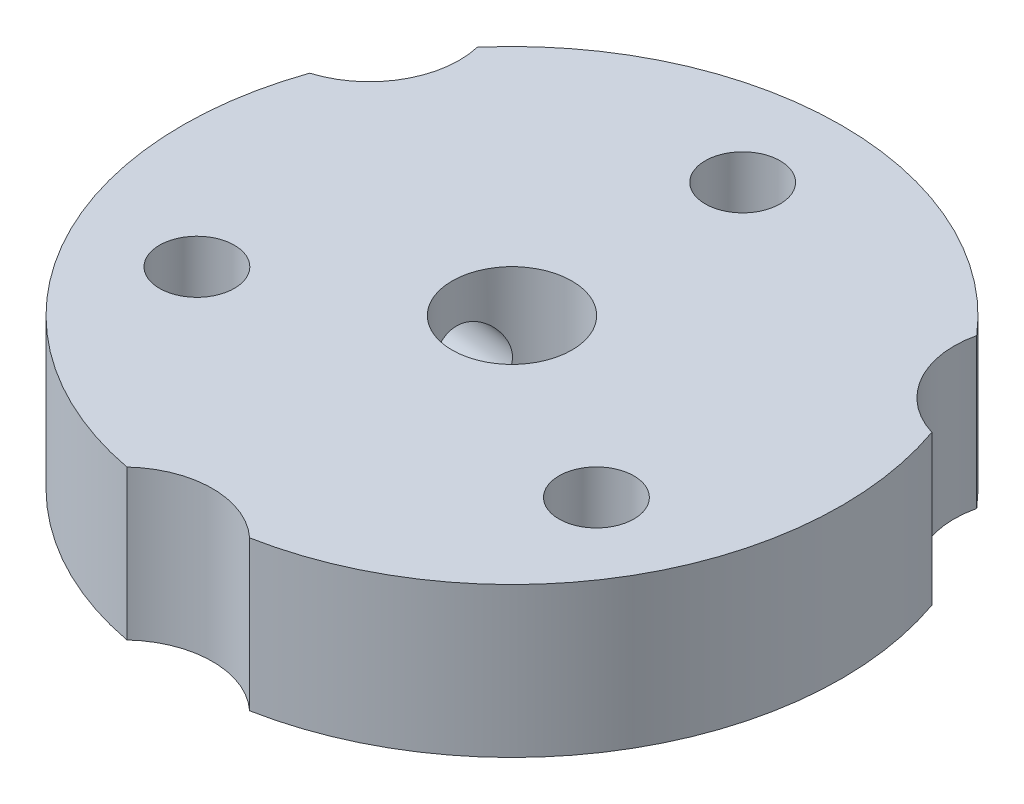
ISO-10303-21;
HEADER;
FILE_DESCRIPTION(('STEP AP214'),'2;1');
FILE_NAME('part.step','',(''),(''),'','','');
FILE_SCHEMA(('AUTOMOTIVE_DESIGN { 1 0 10303 214 1 1 1 1 }'));
ENDSEC;
DATA;
#1=APPLICATION_CONTEXT('core data for automotive mechanical design processes');
#2=APPLICATION_PROTOCOL_DEFINITION('international standard','automotive_design',2000,#1);
#3=PRODUCT_CONTEXT('',#1,'mechanical');
#4=PRODUCT('Part','Part','',(#3));
#5=PRODUCT_RELATED_PRODUCT_CATEGORY('part','',(#4));
#6=PRODUCT_DEFINITION_FORMATION('','',#4);
#7=PRODUCT_DEFINITION_CONTEXT('part definition',#1,'design');
#8=PRODUCT_DEFINITION('design','',#6,#7);
#9=PRODUCT_DEFINITION_SHAPE('','',#8);
#10=(LENGTH_UNIT() NAMED_UNIT(*) SI_UNIT(.MILLI.,.METRE.));
#11=(NAMED_UNIT(*) PLANE_ANGLE_UNIT() SI_UNIT($,.RADIAN.));
#12=(NAMED_UNIT(*) SI_UNIT($,.STERADIAN.) SOLID_ANGLE_UNIT());
#13=UNCERTAINTY_MEASURE_WITH_UNIT(LENGTH_MEASURE(1.E-05),#10,'distance_accuracy_value','');
#14=(GEOMETRIC_REPRESENTATION_CONTEXT(3) GLOBAL_UNCERTAINTY_ASSIGNED_CONTEXT((#13)) GLOBAL_UNIT_ASSIGNED_CONTEXT((#10,
#11,#12)) REPRESENTATION_CONTEXT('',''));
#15=CARTESIAN_POINT('',(0.,0.,0.));
#16=DIRECTION('',(0.,0.,1.));
#17=DIRECTION('',(1.,0.,0.));
#18=AXIS2_PLACEMENT_3D('',#15,#16,#17);
#19=CARTESIAN_POINT('',(0.,-5.09597111351966,-7.7));
#20=DIRECTION('',(0.,1.,0.));
#21=DIRECTION('',(0.,0.,1.));
#22=AXIS2_PLACEMENT_3D('',#19,#20,#21);
#23=CYLINDRICAL_SURFACE('',#22,1.25);
#24=CARTESIAN_POINT('',(0.,5.,-7.7));
#25=DIRECTION('',(0.,1.,0.));
#26=DIRECTION('',(0.,0.,1.));
#27=AXIS2_PLACEMENT_3D('',#24,#25,#26);
#28=CIRCLE('',#27,1.25);
#29=CARTESIAN_POINT('',(0.,5.,-6.45));
#30=VERTEX_POINT('',#29);
#31=EDGE_CURVE('E229',#30,#30,#28,.T.);
#32=ORIENTED_EDGE('',*,*,#31,.T.);
#33=EDGE_LOOP('',(#32));
#34=FACE_BOUND('',#33,.T.);
#35=CARTESIAN_POINT('',(0.,1.5,-7.7));
#36=DIRECTION('',(0.,-1.,0.));
#37=DIRECTION('',(0.,0.,-1.));
#38=AXIS2_PLACEMENT_3D('',#35,#36,#37);
#39=CIRCLE('',#38,1.25);
#40=CARTESIAN_POINT('',(0.,1.5,-8.95));
#41=VERTEX_POINT('',#40);
#42=EDGE_CURVE('E265',#41,#41,#39,.F.);
#43=ORIENTED_EDGE('',*,*,#42,.F.);
#44=EDGE_LOOP('',(#43));
#45=FACE_BOUND('',#44,.T.);
#46=ADVANCED_FACE('F33',(#34,#45),#23,.F.);
#47=CARTESIAN_POINT('',(-6.66839560914018,-5.09597111351966,3.85));
#48=DIRECTION('',(0.,1.,0.));
#49=DIRECTION('',(0.,0.,1.));
#50=AXIS2_PLACEMENT_3D('',#47,#48,#49);
#51=CYLINDRICAL_SURFACE('',#50,1.25);
#52=CARTESIAN_POINT('',(-6.66839560914018,5.,3.85));
#53=DIRECTION('',(0.,1.,0.));
#54=DIRECTION('',(0.,0.,1.));
#55=AXIS2_PLACEMENT_3D('',#52,#53,#54);
#56=CIRCLE('',#55,1.25);
#57=CARTESIAN_POINT('',(-6.66839560914018,5.,5.1));
#58=VERTEX_POINT('',#57);
#59=EDGE_CURVE('E300',#58,#58,#56,.T.);
#60=ORIENTED_EDGE('',*,*,#59,.T.);
#61=EDGE_LOOP('',(#60));
#62=FACE_BOUND('',#61,.T.);
#63=CARTESIAN_POINT('',(-6.66839560914018,1.5,3.85));
#64=DIRECTION('',(0.,-1.,0.));
#65=DIRECTION('',(0.,0.,-1.));
#66=AXIS2_PLACEMENT_3D('',#63,#64,#65);
#67=CIRCLE('',#66,1.25);
#68=CARTESIAN_POINT('',(-6.66839560914018,1.5,2.6));
#69=VERTEX_POINT('',#68);
#70=EDGE_CURVE('E262',#69,#69,#67,.F.);
#71=ORIENTED_EDGE('',*,*,#70,.F.);
#72=EDGE_LOOP('',(#71));
#73=FACE_BOUND('',#72,.T.);
#74=ADVANCED_FACE('F182',(#62,#73),#51,.F.);
#75=CARTESIAN_POINT('',(6.66839560914018,-5.09597111351966,3.85));
#76=DIRECTION('',(0.,1.,0.));
#77=DIRECTION('',(0.,0.,1.));
#78=AXIS2_PLACEMENT_3D('',#75,#76,#77);
#79=CYLINDRICAL_SURFACE('',#78,1.25);
#80=CARTESIAN_POINT('',(6.66839560914018,5.,3.85));
#81=DIRECTION('',(0.,1.,0.));
#82=DIRECTION('',(0.,0.,1.));
#83=AXIS2_PLACEMENT_3D('',#80,#81,#82);
#84=CIRCLE('',#83,1.25);
#85=CARTESIAN_POINT('',(6.66839560914018,5.,5.1));
#86=VERTEX_POINT('',#85);
#87=EDGE_CURVE('E233',#86,#86,#84,.T.);
#88=ORIENTED_EDGE('',*,*,#87,.T.);
#89=EDGE_LOOP('',(#88));
#90=FACE_BOUND('',#89,.T.);
#91=CARTESIAN_POINT('',(6.66839560914018,1.5,3.85));
#92=DIRECTION('',(0.,-1.,0.));
#93=DIRECTION('',(0.,0.,-1.));
#94=AXIS2_PLACEMENT_3D('',#91,#92,#93);
#95=CIRCLE('',#94,1.25);
#96=CARTESIAN_POINT('',(6.66839560914018,1.5,2.6));
#97=VERTEX_POINT('',#96);
#98=EDGE_CURVE('E257',#97,#97,#95,.F.);
#99=ORIENTED_EDGE('',*,*,#98,.F.);
#100=EDGE_LOOP('',(#99));
#101=FACE_BOUND('',#100,.T.);
#102=ADVANCED_FACE('F185',(#90,#101),#79,.F.);
#103=CARTESIAN_POINT('',(0.,5.,0.));
#104=DIRECTION('',(0.,-1.,0.));
#105=DIRECTION('',(0.,0.,-1.));
#106=AXIS2_PLACEMENT_3D('',#103,#104,#105);
#107=CYLINDRICAL_SURFACE('',#106,11.);
#108=CARTESIAN_POINT('',(0.,0.,0.));
#109=DIRECTION('',(0.,1.,0.));
#110=DIRECTION('',(0.,0.,1.));
#111=AXIS2_PLACEMENT_3D('',#108,#109,#110);
#112=CIRCLE('',#111,11.);
#113=CARTESIAN_POINT('',(2.04787377107266,0.,10.8076923076924));
#114=VERTEX_POINT('',#113);
#115=CARTESIAN_POINT('',(10.3836729802836,0.,-3.63033544435343));
#116=VERTEX_POINT('',#115);
#117=EDGE_CURVE('E228',#114,#116,#112,.T.);
#118=ORIENTED_EDGE('',*,*,#117,.T.);
#119=DIRECTION('',(0.,1.,0.));
#120=VECTOR('',#119,1.);
#121=CARTESIAN_POINT('',(10.3836729802836,2.25,-3.63033544435342));
#122=LINE('',#121,#120);
#123=CARTESIAN_POINT('',(10.3836729802836,5.,-3.63033544435342));
#124=VERTEX_POINT('',#123);
#125=EDGE_CURVE('E60',#116,#124,#122,.T.);
#126=ORIENTED_EDGE('',*,*,#125,.T.);
#127=CARTESIAN_POINT('',(0.,5.,0.));
#128=DIRECTION('',(0.,1.,0.));
#129=DIRECTION('',(0.,0.,1.));
#130=AXIS2_PLACEMENT_3D('',#127,#128,#129);
#131=CIRCLE('',#130,11.);
#132=CARTESIAN_POINT('',(2.04787377107267,5.,10.8076923076924));
#133=VERTEX_POINT('',#132);
#134=EDGE_CURVE('E241',#133,#124,#131,.T.);
#135=ORIENTED_EDGE('',*,*,#134,.F.);
#136=DIRECTION('',(0.,1.,0.));
#137=VECTOR('',#136,1.);
#138=CARTESIAN_POINT('',(2.04787377107266,2.25,10.8076923076924));
#139=LINE('',#138,#137);
#140=EDGE_CURVE('E289',#133,#114,#139,.F.);
#141=ORIENTED_EDGE('',*,*,#140,.T.);
#142=EDGE_LOOP('',(#118,#126,#135,#141));
#143=FACE_BOUND('',#142,.T.);
#144=ADVANCED_FACE('F189',(#143),#107,.T.);
#145=CARTESIAN_POINT('',(-10.8151753039225,1.37631950177811,-2.00797986678795));
#146=CARTESIAN_POINT('',(-10.8099911409621,1.39718641981964,-2.03590371544942));
#147=CARTESIAN_POINT('',(-10.8048610677785,1.41923836989518,-2.06293059242128));
#148=CARTESIAN_POINT('',(-10.7947826922256,1.46557250699941,-2.11503415636284));
#149=CARTESIAN_POINT('',(-10.7898343821235,1.48985459899689,-2.14011092634685));
#150=CARTESIAN_POINT('',(-10.7753850296636,1.56576975678842,-2.21211932753316));
#151=CARTESIAN_POINT('',(-10.766264952597,1.62052967582436,-2.25590643955555));
#152=CARTESIAN_POINT('',(-10.7496536487296,1.73678062259851,-2.333782738495));
#153=CARTESIAN_POINT('',(-10.7421632516677,1.79827505532038,-2.36786698798654));
#154=CARTESIAN_POINT('',(-10.7293223307766,1.92625475231646,-2.42538941705213));
#155=CARTESIAN_POINT('',(-10.7239712094188,1.99273861680416,-2.44883056963545));
#156=CARTESIAN_POINT('',(-10.7157970500018,2.12860993941782,-2.48435673312713));
#157=CARTESIAN_POINT('',(-10.7129665539375,2.19798819165214,-2.49647525062268));
#158=CARTESIAN_POINT('',(-10.710008969849,2.33786067352875,-2.50913357464562));
#159=CARTESIAN_POINT('',(-10.7098822204619,2.40835504185512,-2.50967193078835));
#160=CARTESIAN_POINT('',(-10.7123355936731,2.54805453484292,-2.49917862967624));
#161=CARTESIAN_POINT('',(-10.7149015113838,2.61726448448523,-2.48820768862669));
#162=CARTESIAN_POINT('',(-10.7225362042142,2.75282008573121,-2.45509729802147));
#163=CARTESIAN_POINT('',(-10.7276051286564,2.81916556619178,-2.43295718214211));
#164=CARTESIAN_POINT('',(-10.739903057504,2.9472391790097,-2.37808140301242));
#165=CARTESIAN_POINT('',(-10.7471360187619,3.00895859203807,-2.34532632153112));
#166=CARTESIAN_POINT('',(-10.7632703499548,3.12591382205315,-2.27012792641021));
#167=CARTESIAN_POINT('',(-10.7721705483863,3.18115414759316,-2.227691411007));
#168=CARTESIAN_POINT('',(-10.7869353783319,3.26126242977284,-2.15470324227985));
#169=CARTESIAN_POINT('',(-10.7924327467309,3.28887599822827,-2.12703083711165));
#170=CARTESIAN_POINT('',(-10.8036563884301,3.34128490592248,-2.06926920975833));
#171=CARTESIAN_POINT('',(-10.8093822370386,3.36608517218246,-2.03918437539443));
#172=CARTESIAN_POINT('',(-10.8151753039225,3.38940171569732,-2.00797986678795));
#173=B_SPLINE_CURVE_WITH_KNOTS('',3,(#145,#146,#147,#148,#149,#150,#151,#152,#153,#154,#155,
#156,#157,#158,#159,#160,#161,#162,#163,#164,#165,#166,#167,#168,#169,#170,#171,#172),
.UNSPECIFIED.,.F.,.F.,(4,2,2,2,2,2,2,2,2,2,2,2,2,4),(0.,0.105662875598633,0.211321250758829,
0.422348349034568,0.633482639972255,0.844557916980096,1.05500657104008,1.26548158308523,
1.47485181110522,1.68423453108157,1.89400246311417,2.10362354845939,2.2218996277388,
2.33996525978241),.UNSPECIFIED.);
#174=CARTESIAN_POINT('',(-10.8151753039225,1.37631950177811,-2.00797986678795));
#175=VERTEX_POINT('',#174);
#176=CARTESIAN_POINT('',(-10.8151753039225,3.38940171569732,-2.00797986678795));
#177=VERTEX_POINT('',#176);
#178=EDGE_CURVE('E111',#175,#177,#173,.T.);
#179=ORIENTED_EDGE('',*,*,#178,.T.);
#180=CARTESIAN_POINT('',(-10.7316373274652,2.75700007407832,-2.41494519021783));
#181=CARTESIAN_POINT('',(-10.7339039046957,2.79222641654172,-2.40486877524478));
#182=CARTESIAN_POINT('',(-10.7364789797176,2.8270070482129,-2.39336365269666));
#183=CARTESIAN_POINT('',(-10.7422029544888,2.89546514831724,-2.36754197251578));
#184=CARTESIAN_POINT('',(-10.745351936626,2.92914245754143,-2.35322501120261));
#185=CARTESIAN_POINT('',(-10.7555974548836,3.02822152517979,-2.30611374995151));
#186=CARTESIAN_POINT('',(-10.7634900770601,3.09163275683577,-2.26916981507875));
#187=CARTESIAN_POINT('',(-10.7808580082285,3.21088219378079,-2.18516129244307));
#188=CARTESIAN_POINT('',(-10.7903300245995,3.26673572494865,-2.13811770232422));
#189=CARTESIAN_POINT('',(-10.810250982252,3.36910811203129,-2.03499866637229));
#190=CARTESIAN_POINT('',(-10.8206989899483,3.41563575726334,-1.97893181537165));
#191=CARTESIAN_POINT('',(-10.8414240336909,3.49576206198035,-1.86195793444617));
#192=CARTESIAN_POINT('',(-10.8516875105793,3.52984939177812,-1.80138347606359));
#193=CARTESIAN_POINT('',(-10.8719067276437,3.58658958292288,-1.67503039137763));
#194=CARTESIAN_POINT('',(-10.8818625113113,3.60924406727942,-1.6092525052886));
#195=CARTESIAN_POINT('',(-10.90040963145,3.64123777293573,-1.47824389525098));
#196=CARTESIAN_POINT('',(-10.9090458396757,3.65123854579674,-1.41318066353723));
#197=CARTESIAN_POINT('',(-10.9252166766219,3.65974582937888,-1.28218208982058));
#198=CARTESIAN_POINT('',(-10.9327516315757,3.65825575118962,-1.21624701242898));
#199=CARTESIAN_POINT('',(-10.9462914149155,3.64407699646142,-1.08754968985178));
#200=CARTESIAN_POINT('',(-10.9523366220685,3.63173888597912,-1.02475261277726));
#201=CARTESIAN_POINT('',(-10.9631317920151,3.59681375693044,-0.901965890872977));
#202=CARTESIAN_POINT('',(-10.9678816964229,3.57422627649534,-0.841976372695027));
#203=CARTESIAN_POINT('',(-10.9761929361846,3.51928179577261,-0.72569358661917));
#204=CARTESIAN_POINT('',(-10.9797394146441,3.48681145111054,-0.669452957857474));
#205=CARTESIAN_POINT('',(-10.9857211039223,3.41328425381054,-0.562839300775519));
#206=CARTESIAN_POINT('',(-10.9881561104503,3.37222582468674,-0.512467352396208));
#207=CARTESIAN_POINT('',(-10.9922185178206,3.28072115417655,-0.416583829248241));
#208=CARTESIAN_POINT('',(-10.9938042515657,3.22993342841577,-0.371396582913663));
#209=CARTESIAN_POINT('',(-10.9962619721107,3.12181973508064,-0.289653704254174));
#210=CARTESIAN_POINT('',(-10.9971337839461,3.06449216867364,-0.253100189402908));
#211=CARTESIAN_POINT('',(-10.9984498839319,2.94169539003493,-0.187697263072809));
#212=CARTESIAN_POINT('',(-10.9988693433125,2.8759568289033,-0.159352641723869));
#213=CARTESIAN_POINT('',(-10.9994366636098,2.74076334819677,-0.113654371670861));
#214=CARTESIAN_POINT('',(-10.9995844706573,2.67130769432619,-0.0963029033731388));
#215=CARTESIAN_POINT('',(-10.9997677674609,2.52791661347726,-0.0725211171113737));
#216=CARTESIAN_POINT('',(-10.9997989257191,2.45391038051143,-0.0665160029791493));
#217=CARTESIAN_POINT('',(-10.9997968838994,2.3059205458112,-0.0668414780941586));
#218=CARTESIAN_POINT('',(-10.9997636765104,2.23193694760245,-0.0731734686585846));
#219=CARTESIAN_POINT('',(-10.999568850021,2.08510457270121,-0.09819862443149));
#220=CARTESIAN_POINT('',(-10.999405588502,2.01228254275344,-0.117049375896942));
#221=CARTESIAN_POINT('',(-10.99876260472,1.87088812465637,-0.166845228734321));
#222=CARTESIAN_POINT('',(-10.9982828790765,1.80231578191304,-0.197790459304416));
#223=CARTESIAN_POINT('',(-10.9967300927198,1.67230234245901,-0.270616069977095));
#224=CARTESIAN_POINT('',(-10.9956640819278,1.61078681133271,-0.312363458180661));
#225=CARTESIAN_POINT('',(-10.9926065258461,1.495980514025,-0.405937095582341));
#226=CARTESIAN_POINT('',(-10.9906151537464,1.44268821127483,-0.457761457725764));
#227=CARTESIAN_POINT('',(-10.9854610513009,1.34809655115075,-0.567947887502209));
#228=CARTESIAN_POINT('',(-10.9823457551077,1.30641813380122,-0.625986315659212));
#229=CARTESIAN_POINT('',(-10.9746776934283,1.23404385112479,-0.748466772967511));
#230=CARTESIAN_POINT('',(-10.9701254749203,1.20334381624061,-0.812906359070899));
#231=CARTESIAN_POINT('',(-10.9597289633679,1.15556192003134,-0.942513225605208));
#232=CARTESIAN_POINT('',(-10.9539694938751,1.13782398965474,-1.00744560109343));
#233=CARTESIAN_POINT('',(-10.9410433970521,1.1140259259047,-1.13927527300245));
#234=CARTESIAN_POINT('',(-10.933877214215,1.10796211027111,-1.2061719430822));
#235=CARTESIAN_POINT('',(-10.9186348244519,1.10776582874357,-1.33700034535373));
#236=CARTESIAN_POINT('',(-10.9106098834573,1.11313989678771,-1.400937886498));
#237=CARTESIAN_POINT('',(-10.8937008238012,1.13461152274034,-1.52686582648053));
#238=CARTESIAN_POINT('',(-10.8848167001166,1.15070914334593,-1.5888562139322));
#239=CARTESIAN_POINT('',(-10.8665917732718,1.19297067550167,-1.70905667467618));
#240=CARTESIAN_POINT('',(-10.8572520621621,1.21911145765295,-1.76727507745078));
#241=CARTESIAN_POINT('',(-10.8385382408369,1.28054373090156,-1.87863813169705));
#242=CARTESIAN_POINT('',(-10.8291641312996,1.31583504253236,-1.93178288264873));
#243=CARTESIAN_POINT('',(-10.810502746769,1.3959076119051,-2.03367059801511));
#244=CARTESIAN_POINT('',(-10.8012314550526,1.44099113003042,-2.08217861159917));
#245=CARTESIAN_POINT('',(-10.7836354030886,1.53844613165383,-2.17146955657302));
#246=CARTESIAN_POINT('',(-10.7753112787535,1.59082245956856,-2.21224731008695));
#247=CARTESIAN_POINT('',(-10.7600240507495,1.70169767244581,-2.28545571472739));
#248=CARTESIAN_POINT('',(-10.7530686466311,1.76022850243952,-2.31783945256727));
#249=CARTESIAN_POINT('',(-10.7409358467757,1.88160472138766,-2.37340462084865));
#250=CARTESIAN_POINT('',(-10.7357565686188,1.94444545718244,-2.39659579807834));
#251=CARTESIAN_POINT('',(-10.7316373274652,2.00872114339712,-2.41494519021783));
#252=B_SPLINE_CURVE_WITH_KNOTS('',3,(#180,#181,#182,#183,#184,#185,#186,#187,#188,#189,#190,
#191,#192,#193,#194,#195,#196,#197,#198,#199,#200,#201,#202,#203,#204,#205,#206,#207,#208,#209,
#210,#211,#212,#213,#214,#215,#216,#217,#218,#219,#220,#221,#222,#223,#224,#225,#226,#227,#228,
#229,#230,#231,#232,#233,#234,#235,#236,#237,#238,#239,#240,#241,#242,#243,#244,#245,#246,#247,
#248,#249,#250,#251),.UNSPECIFIED.,.F.,.F.,(4,2,2,2,2,2,2,2,2,2,2,2,2,2,2,2,2,2,2,2,2,2,2,2,2,2,
2,2,2,2,2,2,2,2,2,4),(0.,0.11006197898245,0.220139770530324,0.440411607214513,0.660229848508402,
0.879839934557059,1.08954030475762,1.2992108974623,1.49739333269598,1.69551693921313,
1.88746401466202,2.0794197407065,2.27366568080532,2.46794730932208,2.67104608675181,
2.87419462375396,3.08800096163692,3.30184969307792,3.52356468208761,3.74530485619107,
3.96989058727102,4.1944787175331,4.41642347907413,4.63832671830392,4.85178975026128,
5.06517162326806,5.26681880356522,5.4684023696936,5.66146566140528,5.85453008190442,
6.04715251482605,6.2397711701888,6.43950121340892,6.63936457054703,6.84032196506493,
7.04106571265251),.UNSPECIFIED.);
#253=CARTESIAN_POINT('',(-10.9869543184172,3.38940171569732,-0.535569608000931));
#254=VERTEX_POINT('',#253);
#255=EDGE_CURVE('E11',#177,#254,#252,.T.);
#256=ORIENTED_EDGE('',*,*,#255,.T.);
#257=CARTESIAN_POINT('',(-10.9869543184172,3.38940171569733,-0.535569608000931));
#258=CARTESIAN_POINT('',(-10.9883373733577,3.3685347976558,-0.50720230237103));
#259=CARTESIAN_POINT('',(-10.9895665850606,3.34648284758025,-0.479720330674837));
#260=CARTESIAN_POINT('',(-10.9917529693486,3.30014871047602,-0.426696046116309));
#261=CARTESIAN_POINT('',(-10.9927101535182,3.27586661847855,-0.40115365068905));
#262=CARTESIAN_POINT('',(-10.99522498583,3.19995146068701,-0.327752906507796));
#263=CARTESIAN_POINT('',(-10.9964295085212,3.14519154165107,-0.283042324873812));
#264=CARTESIAN_POINT('',(-10.9981912244765,3.02894059487692,-0.203433596020907));
#265=CARTESIAN_POINT('',(-10.9987480886144,2.96744616215505,-0.168540444631579));
#266=CARTESIAN_POINT('',(-10.9994935261078,2.83946646515898,-0.109606893763839));
#267=CARTESIAN_POINT('',(-10.9996822023605,2.77298260067127,-0.0855634635698698));
#268=CARTESIAN_POINT('',(-10.9999055918432,2.63711127805761,-0.0491097220369389));
#269=CARTESIAN_POINT('',(-10.9999407604832,2.56773302582329,-0.0366650871517108));
#270=CARTESIAN_POINT('',(-10.9999765161308,2.42786054394669,-0.0236658874746504));
#271=CARTESIAN_POINT('',(-10.9999770988066,2.35736617562031,-0.0231128120692686));
#272=CARTESIAN_POINT('',(-10.9999490556001,2.21766668263251,-0.0338890647538286));
#273=CARTESIAN_POINT('',(-10.9999205830174,2.1484567329902,-0.0451560373073958));
#274=CARTESIAN_POINT('',(-10.9997283190383,2.01290113174422,-0.079134700247645));
#275=CARTESIAN_POINT('',(-10.9995645195682,1.94655565128365,-0.101847073436842));
#276=CARTESIAN_POINT('',(-10.9988999240535,1.81848203846574,-0.158080057546118));
#277=CARTESIAN_POINT('',(-10.9983985085735,1.75676262543737,-0.191620476057546));
#278=CARTESIAN_POINT('',(-10.9967890755062,1.63980739542229,-0.268513421098053));
#279=CARTESIAN_POINT('',(-10.9956814828125,1.58456706988227,-0.311859062287373));
#280=CARTESIAN_POINT('',(-10.9932481157699,1.50445878770259,-0.386285883409185));
#281=CARTESIAN_POINT('',(-10.9922277364131,1.47684521924716,-0.414480597329985));
#282=CARTESIAN_POINT('',(-10.9898533905993,1.42443631155295,-0.473274629420435));
#283=CARTESIAN_POINT('',(-10.9885000209203,1.39963604529297,-0.503869579845342));
#284=CARTESIAN_POINT('',(-10.9869543184172,1.37631950177811,-0.535569608000931));
#285=B_SPLINE_CURVE_WITH_KNOTS('',3,(#257,#258,#259,#260,#261,#262,#263,#264,#265,#266,#267,
#268,#269,#270,#271,#272,#273,#274,#275,#276,#277,#278,#279,#280,#281,#282,#283,#284),
.UNSPECIFIED.,.F.,.F.,(4,2,2,2,2,2,2,2,2,2,2,2,2,4),(0.,0.105662875598634,0.211321250758829,
0.422348349034568,0.633482639972256,0.844557916980098,1.05500657104009,1.26548158308523,
1.47485181110522,1.68423453108157,1.89400246311418,2.10362354845939,2.2218996277388,
2.33996525978242),.UNSPECIFIED.);
#286=CARTESIAN_POINT('',(-10.9869543184172,1.37631950177811,-0.535569608000931));
#287=VERTEX_POINT('',#286);
#288=EDGE_CURVE('E103',#254,#287,#285,.T.);
#289=ORIENTED_EDGE('',*,*,#288,.T.);
#290=EDGE_CURVE('E38',#287,#175,#252,.T.);
#291=ORIENTED_EDGE('',*,*,#290,.T.);
#292=EDGE_LOOP('',(#179,#256,#289,#291));
#293=FACE_BOUND('',#292,.T.);
#294=CARTESIAN_POINT('',(-10.3836729802836,0.,-3.6303354443534));
#295=VERTEX_POINT('',#294);
#296=CARTESIAN_POINT('',(-2.04787377107266,0.,10.8076923076924));
#297=VERTEX_POINT('',#296);
#298=EDGE_CURVE('E231',#295,#297,#112,.T.);
#299=ORIENTED_EDGE('',*,*,#298,.T.);
#300=DIRECTION('',(0.,1.,0.));
#301=VECTOR('',#300,1.);
#302=CARTESIAN_POINT('',(-2.04787377107266,2.25,10.8076923076924));
#303=LINE('',#302,#301);
#304=CARTESIAN_POINT('',(-2.04787377107266,5.,10.8076923076924));
#305=VERTEX_POINT('',#304);
#306=EDGE_CURVE('E292',#297,#305,#303,.T.);
#307=ORIENTED_EDGE('',*,*,#306,.T.);
#308=CARTESIAN_POINT('',(-10.3836729802836,5.,-3.63033544435341));
#309=VERTEX_POINT('',#308);
#310=EDGE_CURVE('E242',#309,#305,#131,.T.);
#311=ORIENTED_EDGE('',*,*,#310,.F.);
#312=DIRECTION('',(0.,1.,0.));
#313=VECTOR('',#312,1.);
#314=CARTESIAN_POINT('',(-10.3836729802836,2.25,-3.63033544435341));
#315=LINE('',#314,#313);
#316=EDGE_CURVE('E296',#309,#295,#315,.F.);
#317=ORIENTED_EDGE('',*,*,#316,.T.);
#318=EDGE_LOOP('',(#299,#307,#311,#317));
#319=FACE_BOUND('',#318,.T.);
#320=ADVANCED_FACE('F117',(#293,#319),#107,.T.);
#321=CARTESIAN_POINT('',(8.33579920921091,5.,-7.17735686333894));
#322=VERTEX_POINT('',#321);
#323=CARTESIAN_POINT('',(-8.33579920921092,5.,-7.17735686333895));
#324=VERTEX_POINT('',#323);
#325=EDGE_CURVE('E238',#322,#324,#131,.T.);
#326=ORIENTED_EDGE('',*,*,#325,.F.);
#327=DIRECTION('',(0.,1.,0.));
#328=VECTOR('',#327,1.);
#329=CARTESIAN_POINT('',(8.33579920921091,2.25,-7.17735686333894));
#330=LINE('',#329,#328);
#331=CARTESIAN_POINT('',(8.33579920921092,0.,-7.17735686333894));
#332=VERTEX_POINT('',#331);
#333=EDGE_CURVE('E284',#322,#332,#330,.F.);
#334=ORIENTED_EDGE('',*,*,#333,.T.);
#335=CARTESIAN_POINT('',(-8.33579920921091,0.,-7.17735686333895));
#336=VERTEX_POINT('',#335);
#337=EDGE_CURVE('E218',#332,#336,#112,.T.);
#338=ORIENTED_EDGE('',*,*,#337,.T.);
#339=DIRECTION('',(0.,1.,0.));
#340=VECTOR('',#339,1.);
#341=CARTESIAN_POINT('',(-8.33579920921092,2.25,-7.17735686333895));
#342=LINE('',#341,#340);
#343=EDGE_CURVE('E298',#336,#324,#342,.T.);
#344=ORIENTED_EDGE('',*,*,#343,.T.);
#345=EDGE_LOOP('',(#326,#334,#338,#344));
#346=FACE_BOUND('',#345,.T.);
#347=ADVANCED_FACE('F35',(#346),#107,.T.);
#348=CARTESIAN_POINT('',(0.,5.,0.));
#349=DIRECTION('',(0.,1.,0.));
#350=DIRECTION('',(0.,0.,1.));
#351=AXIS2_PLACEMENT_3D('',#348,#349,#350);
#352=PLANE('',#351);
#353=CARTESIAN_POINT('',(0.,5.,0.));
#354=DIRECTION('',(0.,1.,0.));
#355=DIRECTION('',(0.,0.,1.));
#356=AXIS2_PLACEMENT_3D('',#353,#354,#355);
#357=CIRCLE('',#356,2.);
#358=CARTESIAN_POINT('',(0.,5.,2.));
#359=VERTEX_POINT('',#358);
#360=EDGE_CURVE('E274',#359,#359,#357,.T.);
#361=ORIENTED_EDGE('',*,*,#360,.F.);
#362=EDGE_LOOP('',(#361));
#363=FACE_BOUND('',#362,.T.);
#364=CARTESIAN_POINT('',(11.258330249198,5.,-6.50000000000016));
#365=DIRECTION('',(0.,1.,0.));
#366=DIRECTION('',(0.,0.,1.));
#367=AXIS2_PLACEMENT_3D('',#364,#365,#366);
#368=CIRCLE('',#367,3.);
#369=EDGE_CURVE('E260',#322,#124,#368,.T.);
#370=ORIENTED_EDGE('',*,*,#369,.F.);
#371=ORIENTED_EDGE('',*,*,#325,.T.);
#372=CARTESIAN_POINT('',(-11.258330249198,5.,-6.50000000000015));
#373=DIRECTION('',(0.,1.,0.));
#374=DIRECTION('',(0.,0.,1.));
#375=AXIS2_PLACEMENT_3D('',#372,#373,#374);
#376=CIRCLE('',#375,3.);
#377=EDGE_CURVE('E294',#309,#324,#376,.T.);
#378=ORIENTED_EDGE('',*,*,#377,.F.);
#379=ORIENTED_EDGE('',*,*,#310,.T.);
#380=CARTESIAN_POINT('',(0.,5.,13.0000000000003));
#381=DIRECTION('',(0.,1.,0.));
#382=DIRECTION('',(0.,0.,1.));
#383=AXIS2_PLACEMENT_3D('',#380,#381,#382);
#384=CIRCLE('',#383,3.);
#385=EDGE_CURVE('E287',#133,#305,#384,.T.);
#386=ORIENTED_EDGE('',*,*,#385,.F.);
#387=ORIENTED_EDGE('',*,*,#134,.T.);
#388=EDGE_LOOP('',(#370,#371,#378,#379,#386,#387));
#389=FACE_BOUND('',#388,.T.);
#390=ORIENTED_EDGE('',*,*,#59,.F.);
#391=EDGE_LOOP('',(#390));
#392=FACE_BOUND('',#391,.T.);
#393=ORIENTED_EDGE('',*,*,#87,.F.);
#394=EDGE_LOOP('',(#393));
#395=FACE_BOUND('',#394,.T.);
#396=ORIENTED_EDGE('',*,*,#31,.F.);
#397=EDGE_LOOP('',(#396));
#398=FACE_BOUND('',#397,.T.);
#399=ADVANCED_FACE('F194',(#363,#389,#392,#395,#398),#352,.T.);
#400=CARTESIAN_POINT('',(0.,0.,0.));
#401=DIRECTION('',(0.,1.,0.));
#402=DIRECTION('',(0.,0.,1.));
#403=AXIS2_PLACEMENT_3D('',#400,#401,#402);
#404=PLANE('',#403);
#405=CARTESIAN_POINT('',(0.,0.,0.));
#406=DIRECTION('',(0.,-1.,0.));
#407=DIRECTION('',(0.,0.,-1.));
#408=AXIS2_PLACEMENT_3D('',#405,#406,#407);
#409=CIRCLE('',#408,2.);
#410=CARTESIAN_POINT('',(0.,0.,-2.));
#411=VERTEX_POINT('',#410);
#412=EDGE_CURVE('E110',#411,#411,#409,.T.);
#413=ORIENTED_EDGE('',*,*,#412,.F.);
#414=EDGE_LOOP('',(#413));
#415=FACE_BOUND('',#414,.T.);
#416=CARTESIAN_POINT('',(0.,0.,-7.7));
#417=DIRECTION('',(0.,-1.,0.));
#418=DIRECTION('',(0.,0.,-1.));
#419=AXIS2_PLACEMENT_3D('',#416,#417,#418);
#420=CIRCLE('',#419,3.);
#421=CARTESIAN_POINT('',(0.,0.,-10.7));
#422=VERTEX_POINT('',#421);
#423=EDGE_CURVE('E207',#422,#422,#420,.T.);
#424=ORIENTED_EDGE('',*,*,#423,.F.);
#425=EDGE_LOOP('',(#424));
#426=FACE_BOUND('',#425,.T.);
#427=CARTESIAN_POINT('',(-6.66839560914018,0.,3.85));
#428=DIRECTION('',(0.,-1.,0.));
#429=DIRECTION('',(0.,0.,-1.));
#430=AXIS2_PLACEMENT_3D('',#427,#428,#429);
#431=CIRCLE('',#430,3.);
#432=CARTESIAN_POINT('',(-6.66839560914018,0.,0.850000000000001));
#433=VERTEX_POINT('',#432);
#434=EDGE_CURVE('E211',#433,#433,#431,.T.);
#435=ORIENTED_EDGE('',*,*,#434,.F.);
#436=EDGE_LOOP('',(#435));
#437=FACE_BOUND('',#436,.T.);
#438=CARTESIAN_POINT('',(6.66839560914018,0.,3.85));
#439=DIRECTION('',(0.,-1.,0.));
#440=DIRECTION('',(0.,0.,-1.));
#441=AXIS2_PLACEMENT_3D('',#438,#439,#440);
#442=CIRCLE('',#441,3.);
#443=CARTESIAN_POINT('',(6.66839560914018,0.,0.849999999999996));
#444=VERTEX_POINT('',#443);
#445=EDGE_CURVE('E215',#444,#444,#442,.T.);
#446=ORIENTED_EDGE('',*,*,#445,.F.);
#447=EDGE_LOOP('',(#446));
#448=FACE_BOUND('',#447,.T.);
#449=ORIENTED_EDGE('',*,*,#337,.F.);
#450=CARTESIAN_POINT('',(11.258330249198,0.,-6.50000000000016));
#451=DIRECTION('',(0.,1.,0.));
#452=DIRECTION('',(0.,0.,1.));
#453=AXIS2_PLACEMENT_3D('',#450,#451,#452);
#454=CIRCLE('',#453,3.);
#455=EDGE_CURVE('E220',#332,#116,#454,.T.);
#456=ORIENTED_EDGE('',*,*,#455,.T.);
#457=ORIENTED_EDGE('',*,*,#117,.F.);
#458=CARTESIAN_POINT('',(0.,0.,13.0000000000003));
#459=DIRECTION('',(0.,1.,0.));
#460=DIRECTION('',(0.,0.,1.));
#461=AXIS2_PLACEMENT_3D('',#458,#459,#460);
#462=CIRCLE('',#461,3.);
#463=EDGE_CURVE('E252',#114,#297,#462,.T.);
#464=ORIENTED_EDGE('',*,*,#463,.T.);
#465=ORIENTED_EDGE('',*,*,#298,.F.);
#466=CARTESIAN_POINT('',(-11.258330249198,0.,-6.50000000000015));
#467=DIRECTION('',(0.,1.,0.));
#468=DIRECTION('',(0.,0.,1.));
#469=AXIS2_PLACEMENT_3D('',#466,#467,#468);
#470=CIRCLE('',#469,3.);
#471=EDGE_CURVE('E223',#295,#336,#470,.T.);
#472=ORIENTED_EDGE('',*,*,#471,.T.);
#473=EDGE_LOOP('',(#449,#456,#457,#464,#465,#472));
#474=FACE_BOUND('',#473,.T.);
#475=ADVANCED_FACE('F180',(#415,#426,#437,#448,#474),#404,.F.);
#476=CARTESIAN_POINT('',(-11.258330249198,-0.5,-6.50000000000015));
#477=DIRECTION('',(0.,1.,0.));
#478=DIRECTION('',(0.,0.,1.));
#479=AXIS2_PLACEMENT_3D('',#476,#477,#478);
#480=CYLINDRICAL_SURFACE('',#479,3.);
#481=ORIENTED_EDGE('',*,*,#471,.F.);
#482=ORIENTED_EDGE('',*,*,#316,.F.);
#483=ORIENTED_EDGE('',*,*,#377,.T.);
#484=ORIENTED_EDGE('',*,*,#343,.F.);
#485=EDGE_LOOP('',(#481,#482,#483,#484));
#486=FACE_BOUND('',#485,.T.);
#487=ADVANCED_FACE('F176',(#486),#480,.F.);
#488=CARTESIAN_POINT('',(0.,-0.5,13.0000000000003));
#489=DIRECTION('',(0.,1.,0.));
#490=DIRECTION('',(0.,0.,1.));
#491=AXIS2_PLACEMENT_3D('',#488,#489,#490);
#492=CYLINDRICAL_SURFACE('',#491,3.);
#493=ORIENTED_EDGE('',*,*,#463,.F.);
#494=ORIENTED_EDGE('',*,*,#140,.F.);
#495=ORIENTED_EDGE('',*,*,#385,.T.);
#496=ORIENTED_EDGE('',*,*,#306,.F.);
#497=EDGE_LOOP('',(#493,#494,#495,#496));
#498=FACE_BOUND('',#497,.T.);
#499=ADVANCED_FACE('F173',(#498),#492,.F.);
#500=CARTESIAN_POINT('',(11.258330249198,-0.5,-6.50000000000016));
#501=DIRECTION('',(0.,1.,0.));
#502=DIRECTION('',(0.,0.,1.));
#503=AXIS2_PLACEMENT_3D('',#500,#501,#502);
#504=CYLINDRICAL_SURFACE('',#503,3.);
#505=ORIENTED_EDGE('',*,*,#455,.F.);
#506=ORIENTED_EDGE('',*,*,#333,.F.);
#507=ORIENTED_EDGE('',*,*,#369,.T.);
#508=ORIENTED_EDGE('',*,*,#125,.F.);
#509=EDGE_LOOP('',(#505,#506,#507,#508));
#510=FACE_BOUND('',#509,.T.);
#511=ADVANCED_FACE('F166',(#510),#504,.F.);
#512=CARTESIAN_POINT('',(6.66839560914018,1.5,3.85));
#513=DIRECTION('',(0.,-1.,0.));
#514=DIRECTION('',(0.,0.,-1.));
#515=AXIS2_PLACEMENT_3D('',#512,#513,#514);
#516=PLANE('',#515);
#517=CARTESIAN_POINT('',(6.66839560914018,1.5,3.85));
#518=DIRECTION('',(0.,-1.,0.));
#519=DIRECTION('',(0.,0.,-1.));
#520=AXIS2_PLACEMENT_3D('',#517,#518,#519);
#521=CIRCLE('',#520,3.);
#522=CARTESIAN_POINT('',(6.66839560914018,1.5,0.849999999999996));
#523=VERTEX_POINT('',#522);
#524=EDGE_CURVE('E261',#523,#523,#521,.T.);
#525=ORIENTED_EDGE('',*,*,#524,.T.);
#526=EDGE_LOOP('',(#525));
#527=FACE_BOUND('',#526,.T.);
#528=ORIENTED_EDGE('',*,*,#98,.T.);
#529=EDGE_LOOP('',(#528));
#530=FACE_BOUND('',#529,.T.);
#531=ADVANCED_FACE('F163',(#527,#530),#516,.T.);
#532=CARTESIAN_POINT('',(6.66839560914018,1.5,3.85));
#533=DIRECTION('',(0.,-1.,0.));
#534=DIRECTION('',(0.,0.,-1.));
#535=AXIS2_PLACEMENT_3D('',#532,#533,#534);
#536=CYLINDRICAL_SURFACE('',#535,3.);
#537=ORIENTED_EDGE('',*,*,#524,.F.);
#538=EDGE_LOOP('',(#537));
#539=FACE_BOUND('',#538,.T.);
#540=ORIENTED_EDGE('',*,*,#445,.T.);
#541=EDGE_LOOP('',(#540));
#542=FACE_BOUND('',#541,.T.);
#543=ADVANCED_FACE('F158',(#539,#542),#536,.F.);
#544=CARTESIAN_POINT('',(-6.66839560914018,1.5,3.85));
#545=DIRECTION('',(0.,-1.,0.));
#546=DIRECTION('',(0.,0.,-1.));
#547=AXIS2_PLACEMENT_3D('',#544,#545,#546);
#548=PLANE('',#547);
#549=CARTESIAN_POINT('',(-6.66839560914018,1.5,3.85));
#550=DIRECTION('',(0.,-1.,0.));
#551=DIRECTION('',(0.,0.,-1.));
#552=AXIS2_PLACEMENT_3D('',#549,#550,#551);
#553=CIRCLE('',#552,3.);
#554=CARTESIAN_POINT('',(-6.66839560914018,1.5,0.850000000000001));
#555=VERTEX_POINT('',#554);
#556=EDGE_CURVE('E264',#555,#555,#553,.T.);
#557=ORIENTED_EDGE('',*,*,#556,.T.);
#558=EDGE_LOOP('',(#557));
#559=FACE_BOUND('',#558,.T.);
#560=ORIENTED_EDGE('',*,*,#70,.T.);
#561=EDGE_LOOP('',(#560));
#562=FACE_BOUND('',#561,.T.);
#563=ADVANCED_FACE('F155',(#559,#562),#548,.T.);
#564=CARTESIAN_POINT('',(-6.66839560914018,1.5,3.85));
#565=DIRECTION('',(0.,-1.,0.));
#566=DIRECTION('',(0.,0.,-1.));
#567=AXIS2_PLACEMENT_3D('',#564,#565,#566);
#568=CYLINDRICAL_SURFACE('',#567,3.);
#569=ORIENTED_EDGE('',*,*,#556,.F.);
#570=EDGE_LOOP('',(#569));
#571=FACE_BOUND('',#570,.T.);
#572=ORIENTED_EDGE('',*,*,#434,.T.);
#573=EDGE_LOOP('',(#572));
#574=FACE_BOUND('',#573,.T.);
#575=ADVANCED_FACE('F150',(#571,#574),#568,.F.);
#576=CARTESIAN_POINT('',(0.,1.5,-7.7));
#577=DIRECTION('',(0.,-1.,0.));
#578=DIRECTION('',(0.,0.,-1.));
#579=AXIS2_PLACEMENT_3D('',#576,#577,#578);
#580=PLANE('',#579);
#581=CARTESIAN_POINT('',(0.,1.5,-7.7));
#582=DIRECTION('',(0.,-1.,0.));
#583=DIRECTION('',(0.,0.,-1.));
#584=AXIS2_PLACEMENT_3D('',#581,#582,#583);
#585=CIRCLE('',#584,3.);
#586=CARTESIAN_POINT('',(0.,1.5,-10.7));
#587=VERTEX_POINT('',#586);
#588=EDGE_CURVE('E267',#587,#587,#585,.T.);
#589=ORIENTED_EDGE('',*,*,#588,.T.);
#590=EDGE_LOOP('',(#589));
#591=FACE_BOUND('',#590,.T.);
#592=ORIENTED_EDGE('',*,*,#42,.T.);
#593=EDGE_LOOP('',(#592));
#594=FACE_BOUND('',#593,.T.);
#595=ADVANCED_FACE('F147',(#591,#594),#580,.T.);
#596=CARTESIAN_POINT('',(0.,1.5,-7.7));
#597=DIRECTION('',(0.,-1.,0.));
#598=DIRECTION('',(0.,0.,-1.));
#599=AXIS2_PLACEMENT_3D('',#596,#597,#598);
#600=CYLINDRICAL_SURFACE('',#599,3.);
#601=ORIENTED_EDGE('',*,*,#588,.F.);
#602=EDGE_LOOP('',(#601));
#603=FACE_BOUND('',#602,.T.);
#604=ORIENTED_EDGE('',*,*,#423,.T.);
#605=EDGE_LOOP('',(#604));
#606=FACE_BOUND('',#605,.T.);
#607=ADVANCED_FACE('F145',(#603,#606),#600,.F.);
#608=CARTESIAN_POINT('',(0.,10.,0.));
#609=DIRECTION('',(0.,-1.,0.));
#610=DIRECTION('',(0.,0.,-1.));
#611=AXIS2_PLACEMENT_3D('',#608,#609,#610);
#612=CYLINDRICAL_SURFACE('',#611,2.);
#613=CARTESIAN_POINT('',(-1.69558090234941,2.38286060873772,1.06066271905255));
#614=CARTESIAN_POINT('',(-1.69558872301949,2.44498089054065,1.06065639228254));
#615=CARTESIAN_POINT('',(-1.69879087499414,2.50719844410797,1.05558347100884));
#616=CARTESIAN_POINT('',(-1.71097961161561,2.62953692881709,1.03569966817335));
#617=CARTESIAN_POINT('',(-1.71998191033171,2.68965169510295,1.02086232998218));
#618=CARTESIAN_POINT('',(-1.74210291906194,2.80564293143656,0.982626818111187));
#619=CARTESIAN_POINT('',(-1.75518581152177,2.86155121741953,0.959302850216173));
#620=CARTESIAN_POINT('',(-1.78373052909819,2.96886947037587,0.905119616396075));
#621=CARTESIAN_POINT('',(-1.79919241910194,3.02027931459422,0.874260144926638));
#622=CARTESIAN_POINT('',(-1.83299050462541,3.12472576321469,0.801231468784756));
#623=CARTESIAN_POINT('',(-1.85143402581734,3.1770553495703,0.758100401147997));
#624=CARTESIAN_POINT('',(-1.88719656240892,3.27474330788268,0.66409555448804));
#625=CARTESIAN_POINT('',(-1.90451459056393,3.32009560602163,0.613215105336427));
#626=CARTESIAN_POINT('',(-1.93805396105231,3.40796419388583,0.49796104122564));
#627=CARTESIAN_POINT('',(-1.95389094750928,3.44947827684202,0.432700124146966));
#628=CARTESIAN_POINT('',(-1.97935394914247,3.52098581350087,0.295025521292452));
#629=CARTESIAN_POINT('',(-1.98898612064638,3.55099067448896,0.222619007809751));
#630=CARTESIAN_POINT('',(-1.99951047579391,3.59534291934477,0.0806182097782227));
#631=CARTESIAN_POINT('',(-2.0011916741848,3.61097202513464,0.0114864320022961));
#632=CARTESIAN_POINT('',(-1.99710574991423,3.63049267838111,-0.128181529518658));
#633=CARTESIAN_POINT('',(-1.99134646637258,3.63439656485826,-0.198716158207088));
#634=CARTESIAN_POINT('',(-1.97370182283663,3.6305049194601,-0.32899323565918));
#635=CARTESIAN_POINT('',(-1.96274237010854,3.6242092324368,-0.388913622539279));
#636=CARTESIAN_POINT('',(-1.93585432236499,3.60299362437439,-0.506041029643269));
#637=CARTESIAN_POINT('',(-1.91992535181475,3.58807305150019,-0.563247844432387));
#638=CARTESIAN_POINT('',(-1.88400026410532,3.55025683364059,-0.673744457837627));
#639=CARTESIAN_POINT('',(-1.86399379626874,3.52734078468912,-0.727023808368886));
#640=CARTESIAN_POINT('',(-1.82110357301505,3.47439185347772,-0.828629553118066));
#641=CARTESIAN_POINT('',(-1.79821916264709,3.44435734984711,-0.876954815345533));
#642=CARTESIAN_POINT('',(-1.74786213495249,3.37383244340834,-0.97381475341306));
#643=CARTESIAN_POINT('',(-1.72017294093486,3.33250598199538,-1.02162707667828));
#644=CARTESIAN_POINT('',(-1.66454654849598,3.24272822851434,-1.10996247148801));
#645=CARTESIAN_POINT('',(-1.63660904605701,3.19426658229116,-1.15047475638637));
#646=CARTESIAN_POINT('',(-1.57898201216069,3.0841549858316,-1.22860242119578));
#647=CARTESIAN_POINT('',(-1.54954012021166,3.02160922788741,-1.26514861321225));
#648=CARTESIAN_POINT('',(-1.49638022033007,2.88921448896429,-1.32760460803668));
#649=CARTESIAN_POINT('',(-1.47265170030164,2.8193792647823,-1.3535340073636));
#650=CARTESIAN_POINT('',(-1.43973407413376,2.69309120584984,-1.38837401651592));
#651=CARTESIAN_POINT('',(-1.42836234394365,2.63794964610004,-1.39996711680812));
#652=CARTESIAN_POINT('',(-1.41218671115784,2.52574541998878,-1.4162858994204));
#653=CARTESIAN_POINT('',(-1.40737383621138,2.46868548769781,-1.42102096392114));
#654=CARTESIAN_POINT('',(-1.4049857470914,2.35413192819744,-1.4233829418809));
#655=CARTESIAN_POINT('',(-1.40742711904689,2.29663760737189,-1.42099356595739));
#656=CARTESIAN_POINT('',(-1.41922318945994,2.18308002770611,-1.40920925826515));
#657=CARTESIAN_POINT('',(-1.42858361306925,2.12701799377479,-1.39980852490852));
#658=CARTESIAN_POINT('',(-1.45279322289144,2.01864222487191,-1.37465859298226));
#659=CARTESIAN_POINT('',(-1.467549386354,1.9662819354062,-1.35901659983286));
#660=CARTESIAN_POINT('',(-1.50109026072126,1.86507327418073,-1.32187479131596));
#661=CARTESIAN_POINT('',(-1.5198764009906,1.81622615671322,-1.30037289680685));
#662=CARTESIAN_POINT('',(-1.56387387746759,1.71355456956068,-1.2472768143406));
#663=CARTESIAN_POINT('',(-1.58962754126873,1.66055306748839,-1.21454056592677));
#664=CARTESIAN_POINT('',(-1.64270234605474,1.56067555629857,-1.14173690361979));
#665=CARTESIAN_POINT('',(-1.6700250934245,1.51380599175975,-1.10166188122529));
#666=CARTESIAN_POINT('',(-1.72873017398013,1.41987736249456,-1.00749177179365));
#667=CARTESIAN_POINT('',(-1.76006124502834,1.37399205173004,-0.952179058248619));
#668=CARTESIAN_POINT('',(-1.81960051159039,1.29279195686186,-0.832763999380803));
#669=CARTESIAN_POINT('',(-1.84781016675422,1.25747221876408,-0.768665794029515));
#670=CARTESIAN_POINT('',(-1.89705195164991,1.20086561753508,-0.63704643788596));
#671=CARTESIAN_POINT('',(-1.91841222112915,1.17886640226696,-0.569958621822012));
#672=CARTESIAN_POINT('',(-1.95426537534696,1.14713394005664,-0.431224827915361));
#673=CARTESIAN_POINT('',(-1.96876774604242,1.13738371897661,-0.359585302688798));
#674=CARTESIAN_POINT('',(-1.98825165662952,1.13131408869894,-0.225315916918705));
#675=CARTESIAN_POINT('',(-1.99432246425609,1.13322483195074,-0.162916808395538));
#676=CARTESIAN_POINT('',(-2.00058767401421,1.14632228371206,-0.038808221430693));
#677=CARTESIAN_POINT('',(-2.00078234277976,1.15750857131349,0.0229012881750102));
#678=CARTESIAN_POINT('',(-1.99582907077713,1.18802108361432,0.141722867771496));
#679=CARTESIAN_POINT('',(-1.99086624506533,1.20705144861093,0.198920162800717));
#680=CARTESIAN_POINT('',(-1.97665910994169,1.25242053690179,0.309747271392468));
#681=CARTESIAN_POINT('',(-1.96741407801035,1.27876049321332,0.363376481179263));
#682=CARTESIAN_POINT('',(-1.94449073414913,1.34102118772893,0.471507012387038));
#683=CARTESIAN_POINT('',(-1.93045187170877,1.37765259005671,0.52552109107179));
#684=CARTESIAN_POINT('',(-1.89982508574553,1.45793723907043,0.627292181601796));
#685=CARTESIAN_POINT('',(-1.88323428689735,1.50159840898367,0.675042021520683));
#686=CARTESIAN_POINT('',(-1.84666235050439,1.601976871041,0.769920475090427));
#687=CARTESIAN_POINT('',(-1.82653722728592,1.65966895391465,0.815967460991917));
#688=CARTESIAN_POINT('',(-1.7878111800362,1.78250527474785,0.897650229118205));
#689=CARTESIAN_POINT('',(-1.76920941720351,1.84764536364533,0.933291768961614));
#690=CARTESIAN_POINT('',(-1.74027509547513,1.9692633766674,0.98597152731992));
#691=CARTESIAN_POINT('',(-1.7290236460764,2.02449628961709,1.00537711982643));
#692=CARTESIAN_POINT('',(-1.71095040506335,2.13782988669492,1.03584272984371));
#693=CARTESIAN_POINT('',(-1.70411460164629,2.19592086376187,1.04692916413453));
#694=CARTESIAN_POINT('',(-1.69856230933837,2.27589113260058,1.05588410564204));
#695=CARTESIAN_POINT('',(-1.69744822056909,2.29722475425471,1.05767290677604));
#696=CARTESIAN_POINT('',(-1.69595607481168,2.33998857525921,1.06006345463346));
#697=CARTESIAN_POINT('',(-1.69557820291975,2.3614187975394,1.06066490283865));
#698=CARTESIAN_POINT('',(-1.69558090234941,2.38286060873772,1.06066271905255));
#699=B_SPLINE_CURVE_WITH_KNOTS('',3,(#613,#614,#615,#616,#617,#618,#619,#620,#621,#622,#623,
#624,#625,#626,#627,#628,#629,#630,#631,#632,#633,#634,#635,#636,#637,#638,#639,#640,#641,#642,
#643,#644,#645,#646,#647,#648,#649,#650,#651,#652,#653,#654,#655,#656,#657,#658,#659,#660,#661,
#662,#663,#664,#665,#666,#667,#668,#669,#670,#671,#672,#673,#674,#675,#676,#677,#678,#679,#680,
#681,#682,#683,#684,#685,#686,#687,#688,#689,#690,#691,#692,#693,#694,#695,#696,#697,#698),
.UNSPECIFIED.,.T.,.F.,(4,2,2,2,2,2,2,2,2,2,2,2,2,2,2,2,2,2,2,2,2,2,2,2,2,2,2,2,2,2,2,2,2,2,2,2,
2,2,2,2,2,2,4),(0.,0.186262444012013,0.373031654397094,0.558205556130399,0.743384509377746,
0.953406207440068,1.1636097099791,1.39917236034456,1.63450092739259,1.84590412815397,
2.05708478092386,2.2399231958351,2.42277543076413,2.60609774825955,2.7894618612817,
2.99564504832106,3.20213044016184,3.43558067920819,3.66859805095275,3.84032775480265,
4.01182230007287,4.18370925240737,4.35573859160079,4.52493212343596,4.69418576487133,
4.89566333610126,5.09735098485251,5.33136598660887,5.56527109061623,5.78520080494546,
6.00482541258958,6.19203601525121,6.37923812308579,6.5599456911442,6.74068376037877,
6.94018144108742,7.13990556958864,7.36841817421245,7.59680409585382,7.77496902270408,
7.95256577963381,8.01684109069493,8.08113255947017),.UNSPECIFIED.);
#700=CARTESIAN_POINT('',(-1.69558090234941,2.38286060873772,1.06066271905255));
#701=VERTEX_POINT('',#700);
#702=EDGE_CURVE('E115',#701,#701,#699,.T.);
#703=ORIENTED_EDGE('',*,*,#702,.T.);
#704=EDGE_LOOP('',(#703));
#705=FACE_BOUND('',#704,.T.);
#706=ORIENTED_EDGE('',*,*,#360,.T.);
#707=EDGE_LOOP('',(#706));
#708=FACE_BOUND('',#707,.T.);
#709=ORIENTED_EDGE('',*,*,#412,.T.);
#710=EDGE_LOOP('',(#709));
#711=FACE_BOUND('',#710,.T.);
#712=ADVANCED_FACE('F142',(#705,#708,#711),#612,.F.);
#713=CARTESIAN_POINT('',(-10.9258963938832,2.38286060873772,-1.27467171857302));
#714=DIRECTION('',(-0.993263308534837,0.,-0.115879247143001));
#715=DIRECTION('',(-0.115879247143002,0.,0.993263308534837));
#716=AXIS2_PLACEMENT_3D('',#713,#714,#715);
#717=CONICAL_SURFACE('',#716,1.275,0.785398163397164);
#718=CARTESIAN_POINT('',(-10.9010648111698,2.38286060873772,-1.27177473739444));
#719=DIRECTION('',(-0.993263308534837,0.,-0.115879247143001));
#720=DIRECTION('',(-0.115879247143002,0.,0.993263308534837));
#721=AXIS2_PLACEMENT_3D('',#718,#719,#720);
#722=CIRCLE('',#721,1.24999999999999);
#723=EDGE_CURVE('E106',#254,#177,#722,.T.);
#724=ORIENTED_EDGE('',*,*,#723,.F.);
#725=ORIENTED_EDGE('',*,*,#255,.F.);
#726=EDGE_LOOP('',(#724,#725));
#727=FACE_BOUND('',#726,.T.);
#728=ADVANCED_FACE('F114',(#727),#717,.F.);
#729=EDGE_CURVE('E52',#175,#287,#722,.T.);
#730=ORIENTED_EDGE('',*,*,#729,.F.);
#731=ORIENTED_EDGE('',*,*,#290,.F.);
#732=EDGE_LOOP('',(#730,#731));
#733=FACE_BOUND('',#732,.T.);
#734=ADVANCED_FACE('F135',(#733),#717,.F.);
#735=CARTESIAN_POINT('',(-10.9258963938832,2.38286060873772,-1.27467171857302));
#736=DIRECTION('',(-0.993263308534837,0.,-0.115879247143001));
#737=DIRECTION('',(-0.115879247143002,0.,0.993263308534837));
#738=AXIS2_PLACEMENT_3D('',#735,#736,#737);
#739=CYLINDRICAL_SURFACE('',#738,1.24999999999999);
#740=ORIENTED_EDGE('',*,*,#702,.F.);
#741=EDGE_LOOP('',(#740));
#742=FACE_BOUND('',#741,.T.);
#743=ORIENTED_EDGE('',*,*,#723,.T.);
#744=ORIENTED_EDGE('',*,*,#178,.F.);
#745=ORIENTED_EDGE('',*,*,#729,.T.);
#746=ORIENTED_EDGE('',*,*,#288,.F.);
#747=EDGE_LOOP('',(#743,#744,#745,#746));
#748=FACE_BOUND('',#747,.T.);
#749=ADVANCED_FACE('F105',(#742,#748),#739,.F.);
#750=CLOSED_SHELL('',(#46,#74,#102,#144,#320,#347,#399,#475,#487,#499,#511,#531,#543,#563,#575,
#595,#607,#712,#728,#734,#749));
#751=MANIFOLD_SOLID_BREP('B2',#750);
#752=ADVANCED_BREP_SHAPE_REPRESENTATION('',(#18,#751),#14);
#753=SHAPE_DEFINITION_REPRESENTATION(#9,#752);
ENDSEC;
END-ISO-10303-21;
